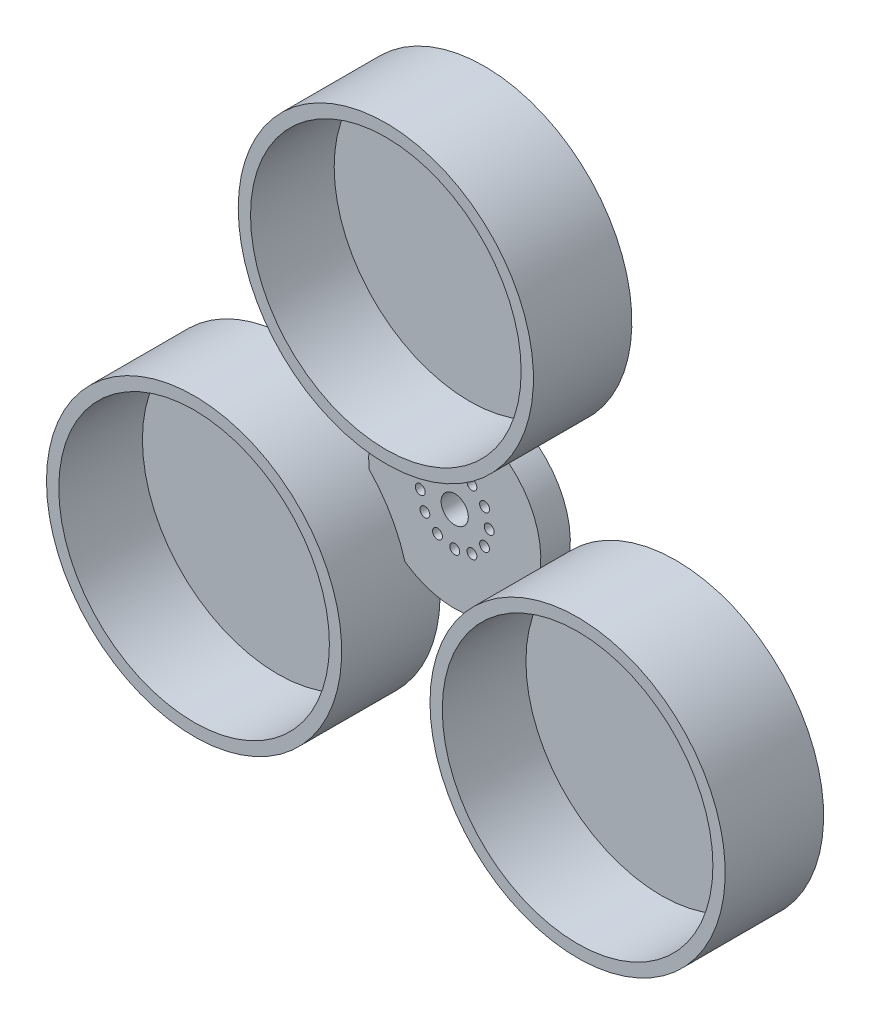
ISO-10303-21;
HEADER;
FILE_DESCRIPTION(('STEP AP214'),'2;1');
FILE_NAME('part.step','',(''),(''),'','','');
FILE_SCHEMA(('AUTOMOTIVE_DESIGN { 1 0 10303 214 1 1 1 1 }'));
ENDSEC;
DATA;
#1=APPLICATION_CONTEXT('core data for automotive mechanical design processes');
#2=APPLICATION_PROTOCOL_DEFINITION('international standard','automotive_design',2000,#1);
#3=PRODUCT_CONTEXT('',#1,'mechanical');
#4=PRODUCT('Part','Part','',(#3));
#5=PRODUCT_RELATED_PRODUCT_CATEGORY('part','',(#4));
#6=PRODUCT_DEFINITION_FORMATION('','',#4);
#7=PRODUCT_DEFINITION_CONTEXT('part definition',#1,'design');
#8=PRODUCT_DEFINITION('design','',#6,#7);
#9=PRODUCT_DEFINITION_SHAPE('','',#8);
#10=(LENGTH_UNIT() NAMED_UNIT(*) SI_UNIT(.MILLI.,.METRE.));
#11=(NAMED_UNIT(*) PLANE_ANGLE_UNIT() SI_UNIT($,.RADIAN.));
#12=(NAMED_UNIT(*) SI_UNIT($,.STERADIAN.) SOLID_ANGLE_UNIT());
#13=UNCERTAINTY_MEASURE_WITH_UNIT(LENGTH_MEASURE(1.E-05),#10,'distance_accuracy_value','');
#14=(GEOMETRIC_REPRESENTATION_CONTEXT(3) GLOBAL_UNCERTAINTY_ASSIGNED_CONTEXT((#13)) GLOBAL_UNIT_ASSIGNED_CONTEXT((#10,
#11,#12)) REPRESENTATION_CONTEXT('',''));
#15=CARTESIAN_POINT('',(0.,0.,0.));
#16=DIRECTION('',(0.,0.,1.));
#17=DIRECTION('',(1.,0.,0.));
#18=AXIS2_PLACEMENT_3D('',#15,#16,#17);
#19=CARTESIAN_POINT('',(0.,0.,6.));
#20=DIRECTION('',(0.,0.,-1.));
#21=DIRECTION('',(-1.,0.,0.));
#22=AXIS2_PLACEMENT_3D('',#19,#20,#21);
#23=CYLINDRICAL_SURFACE('',#22,17.5);
#24=CARTESIAN_POINT('',(0.,0.,0.));
#25=DIRECTION('',(0.,0.,1.));
#26=DIRECTION('',(1.,0.,0.));
#27=AXIS2_PLACEMENT_3D('',#24,#25,#26);
#28=CIRCLE('',#27,17.5);
#29=CARTESIAN_POINT('',(-10.1200985488496,-14.2770306913438,0.));
#30=VERTEX_POINT('',#29);
#31=CARTESIAN_POINT('',(10.1200985488421,-14.2770306913491,0.));
#32=VERTEX_POINT('',#31);
#33=EDGE_CURVE('E52',#30,#32,#28,.T.);
#34=ORIENTED_EDGE('',*,*,#33,.T.);
#35=DIRECTION('',(0.,0.,-1.));
#36=VECTOR('',#35,1.);
#37=CARTESIAN_POINT('',(10.1200985488421,-14.2770306913491,10.));
#38=LINE('',#37,#36);
#39=CARTESIAN_POINT('',(10.1200985488421,-14.2770306913491,6.));
#40=VERTEX_POINT('',#39);
#41=EDGE_CURVE('E11',#32,#40,#38,.F.);
#42=ORIENTED_EDGE('',*,*,#41,.T.);
#43=CARTESIAN_POINT('',(0.,0.,6.));
#44=DIRECTION('',(0.,0.,1.));
#45=DIRECTION('',(1.,0.,0.));
#46=AXIS2_PLACEMENT_3D('',#43,#44,#45);
#47=CIRCLE('',#46,17.5);
#48=CARTESIAN_POINT('',(-10.1200985488496,-14.2770306913438,6.));
#49=VERTEX_POINT('',#48);
#50=EDGE_CURVE('E221',#49,#40,#47,.T.);
#51=ORIENTED_EDGE('',*,*,#50,.F.);
#52=DIRECTION('',(0.,0.,-1.));
#53=VECTOR('',#52,1.);
#54=CARTESIAN_POINT('',(-10.1200985488496,-14.2770306913438,10.));
#55=LINE('',#54,#53);
#56=EDGE_CURVE('E229',#49,#30,#55,.T.);
#57=ORIENTED_EDGE('',*,*,#56,.T.);
#58=EDGE_LOOP('',(#34,#42,#51,#57));
#59=FACE_BOUND('',#58,.T.);
#60=ADVANCED_FACE('F38',(#59),#23,.T.);
#61=CARTESIAN_POINT('',(-7.30422199488881,15.9027777777778,0.));
#62=VERTEX_POINT('',#61);
#63=CARTESIAN_POINT('',(-17.4243205437388,-1.62574708643165,0.));
#64=VERTEX_POINT('',#63);
#65=EDGE_CURVE('E104',#62,#64,#28,.T.);
#66=ORIENTED_EDGE('',*,*,#65,.T.);
#67=DIRECTION('',(0.,0.,-1.));
#68=VECTOR('',#67,1.);
#69=CARTESIAN_POINT('',(-17.4243205437388,-1.62574708643166,10.));
#70=LINE('',#69,#68);
#71=CARTESIAN_POINT('',(-17.4243205437388,-1.62574708643167,6.));
#72=VERTEX_POINT('',#71);
#73=EDGE_CURVE('E108',#64,#72,#70,.F.);
#74=ORIENTED_EDGE('',*,*,#73,.T.);
#75=CARTESIAN_POINT('',(-7.3042219948888,15.9027777777778,6.));
#76=VERTEX_POINT('',#75);
#77=EDGE_CURVE('E218',#76,#72,#47,.T.);
#78=ORIENTED_EDGE('',*,*,#77,.F.);
#79=DIRECTION('',(0.,0.,-1.));
#80=VECTOR('',#79,1.);
#81=CARTESIAN_POINT('',(-7.3042219948888,15.9027777777778,10.));
#82=LINE('',#81,#80);
#83=EDGE_CURVE('E220',#76,#62,#82,.T.);
#84=ORIENTED_EDGE('',*,*,#83,.T.);
#85=EDGE_LOOP('',(#66,#74,#78,#84));
#86=FACE_BOUND('',#85,.T.);
#87=ADVANCED_FACE('F234',(#86),#23,.T.);
#88=CARTESIAN_POINT('',(0.,0.,6.));
#89=DIRECTION('',(0.,0.,-1.));
#90=DIRECTION('',(-1.,0.,0.));
#91=AXIS2_PLACEMENT_3D('',#88,#89,#90);
#92=CYLINDRICAL_SURFACE('',#91,2.75995675837928);
#93=CARTESIAN_POINT('',(0.,0.,6.));
#94=DIRECTION('',(0.,0.,1.));
#95=DIRECTION('',(1.,0.,0.));
#96=AXIS2_PLACEMENT_3D('',#93,#94,#95);
#97=CIRCLE('',#96,2.75995675837928);
#98=CARTESIAN_POINT('',(2.75995675837928,0.,6.));
#99=VERTEX_POINT('',#98);
#100=EDGE_CURVE('E208',#99,#99,#97,.T.);
#101=ORIENTED_EDGE('',*,*,#100,.T.);
#102=EDGE_LOOP('',(#101));
#103=FACE_BOUND('',#102,.T.);
#104=CARTESIAN_POINT('',(0.,0.,2.));
#105=DIRECTION('',(0.,0.,-1.));
#106=DIRECTION('',(-1.,0.,0.));
#107=AXIS2_PLACEMENT_3D('',#104,#105,#106);
#108=CIRCLE('',#107,2.75995675837928);
#109=CARTESIAN_POINT('',(-2.75995675837928,0.,2.));
#110=VERTEX_POINT('',#109);
#111=EDGE_CURVE('E141',#110,#110,#108,.T.);
#112=ORIENTED_EDGE('',*,*,#111,.T.);
#113=EDGE_LOOP('',(#112));
#114=FACE_BOUND('',#113,.T.);
#115=ADVANCED_FACE('F263',(#103,#114),#92,.F.);
#116=CARTESIAN_POINT('',(0.,0.,6.));
#117=DIRECTION('',(0.,0.,1.));
#118=DIRECTION('',(1.,0.,0.));
#119=AXIS2_PLACEMENT_3D('',#116,#117,#118);
#120=PLANE('',#119);
#121=CARTESIAN_POINT('',(38.9711431702969,-22.5000000000017,6.));
#122=DIRECTION('',(0.,0.,1.));
#123=DIRECTION('',(1.,0.,0.));
#124=AXIS2_PLACEMENT_3D('',#121,#122,#123);
#125=CIRCLE('',#124,30.0000000000036);
#126=CARTESIAN_POINT('',(17.4243205437393,-1.62574708642694,6.));
#127=VERTEX_POINT('',#126);
#128=EDGE_CURVE('E60',#127,#40,#125,.T.);
#129=ORIENTED_EDGE('',*,*,#128,.F.);
#130=CARTESIAN_POINT('',(7.3042219948888,15.9027777777778,6.));
#131=VERTEX_POINT('',#130);
#132=EDGE_CURVE('E106',#127,#131,#47,.T.);
#133=ORIENTED_EDGE('',*,*,#132,.T.);
#134=CARTESIAN_POINT('',(0.,45.,6.));
#135=DIRECTION('',(0.,0.,1.));
#136=DIRECTION('',(1.,0.,0.));
#137=AXIS2_PLACEMENT_3D('',#134,#135,#136);
#138=CIRCLE('',#137,30.);
#139=EDGE_CURVE('E133',#76,#131,#138,.T.);
#140=ORIENTED_EDGE('',*,*,#139,.F.);
#141=ORIENTED_EDGE('',*,*,#77,.T.);
#142=CARTESIAN_POINT('',(-38.9711431703026,-22.4999999999983,6.));
#143=DIRECTION('',(0.,0.,1.));
#144=DIRECTION('',(1.,0.,0.));
#145=AXIS2_PLACEMENT_3D('',#142,#143,#144);
#146=CIRCLE('',#145,30.0000000000025);
#147=EDGE_CURVE('E125',#49,#72,#146,.T.);
#148=ORIENTED_EDGE('',*,*,#147,.F.);
#149=ORIENTED_EDGE('',*,*,#50,.T.);
#150=EDGE_LOOP('',(#129,#133,#140,#141,#148,#149));
#151=FACE_BOUND('',#150,.T.);
#152=CARTESIAN_POINT('',(3.50000000000007,6.06217782649103,6.));
#153=DIRECTION('',(0.,0.,1.));
#154=DIRECTION('',(1.,0.,0.));
#155=AXIS2_PLACEMENT_3D('',#152,#153,#154);
#156=CIRCLE('',#155,1.);
#157=CARTESIAN_POINT('',(4.50000000000007,6.06217782649103,6.));
#158=VERTEX_POINT('',#157);
#159=EDGE_CURVE('E151',#158,#158,#156,.T.);
#160=ORIENTED_EDGE('',*,*,#159,.F.);
#161=EDGE_LOOP('',(#160));
#162=FACE_BOUND('',#161,.T.);
#163=CARTESIAN_POINT('',(-3.49999999999994,6.06217782649111,6.));
#164=DIRECTION('',(0.,0.,1.));
#165=DIRECTION('',(1.,0.,0.));
#166=AXIS2_PLACEMENT_3D('',#163,#164,#165);
#167=CIRCLE('',#166,1.);
#168=CARTESIAN_POINT('',(-2.49999999999994,6.06217782649111,6.));
#169=VERTEX_POINT('',#168);
#170=EDGE_CURVE('E163',#169,#169,#167,.T.);
#171=ORIENTED_EDGE('',*,*,#170,.F.);
#172=EDGE_LOOP('',(#171));
#173=FACE_BOUND('',#172,.T.);
#174=CARTESIAN_POINT('',(-7.,0.,6.));
#175=DIRECTION('',(0.,0.,1.));
#176=DIRECTION('',(1.,0.,0.));
#177=AXIS2_PLACEMENT_3D('',#174,#175,#176);
#178=CIRCLE('',#177,1.);
#179=CARTESIAN_POINT('',(-6.,0.,6.));
#180=VERTEX_POINT('',#179);
#181=EDGE_CURVE('E175',#180,#180,#178,.T.);
#182=ORIENTED_EDGE('',*,*,#181,.F.);
#183=EDGE_LOOP('',(#182));
#184=FACE_BOUND('',#183,.T.);
#185=CARTESIAN_POINT('',(-3.50000000000003,-6.06217782649106,6.));
#186=DIRECTION('',(0.,0.,1.));
#187=DIRECTION('',(1.,0.,0.));
#188=AXIS2_PLACEMENT_3D('',#185,#186,#187);
#189=CIRCLE('',#188,1.);
#190=CARTESIAN_POINT('',(-2.50000000000003,-6.06217782649106,6.));
#191=VERTEX_POINT('',#190);
#192=EDGE_CURVE('E187',#191,#191,#189,.T.);
#193=ORIENTED_EDGE('',*,*,#192,.F.);
#194=EDGE_LOOP('',(#193));
#195=FACE_BOUND('',#194,.T.);
#196=CARTESIAN_POINT('',(3.49999999999999,-6.06217782649108,6.));
#197=DIRECTION('',(0.,0.,1.));
#198=DIRECTION('',(1.,0.,0.));
#199=AXIS2_PLACEMENT_3D('',#196,#197,#198);
#200=CIRCLE('',#199,1.);
#201=CARTESIAN_POINT('',(4.49999999999999,-6.06217782649108,6.));
#202=VERTEX_POINT('',#201);
#203=EDGE_CURVE('E199',#202,#202,#200,.T.);
#204=ORIENTED_EDGE('',*,*,#203,.F.);
#205=EDGE_LOOP('',(#204));
#206=FACE_BOUND('',#205,.T.);
#207=ORIENTED_EDGE('',*,*,#100,.F.);
#208=EDGE_LOOP('',(#207));
#209=FACE_BOUND('',#208,.T.);
#210=CARTESIAN_POINT('',(7.,0.,6.));
#211=DIRECTION('',(0.,0.,1.));
#212=DIRECTION('',(1.,0.,0.));
#213=AXIS2_PLACEMENT_3D('',#210,#211,#212);
#214=CIRCLE('',#213,1.);
#215=CARTESIAN_POINT('',(8.,0.,6.));
#216=VERTEX_POINT('',#215);
#217=EDGE_CURVE('E102',#216,#216,#214,.T.);
#218=ORIENTED_EDGE('',*,*,#217,.F.);
#219=EDGE_LOOP('',(#218));
#220=FACE_BOUND('',#219,.T.);
#221=CARTESIAN_POINT('',(6.06217782649107,-3.50000000000001,6.));
#222=DIRECTION('',(0.,0.,1.));
#223=DIRECTION('',(1.,0.,0.));
#224=AXIS2_PLACEMENT_3D('',#221,#222,#223);
#225=CIRCLE('',#224,1.);
#226=CARTESIAN_POINT('',(7.06217782649107,-3.50000000000001,6.));
#227=VERTEX_POINT('',#226);
#228=EDGE_CURVE('E205',#227,#227,#225,.T.);
#229=ORIENTED_EDGE('',*,*,#228,.F.);
#230=EDGE_LOOP('',(#229));
#231=FACE_BOUND('',#230,.T.);
#232=CARTESIAN_POINT('',(0.,-7.,6.));
#233=DIRECTION('',(0.,0.,1.));
#234=DIRECTION('',(1.,0.,0.));
#235=AXIS2_PLACEMENT_3D('',#232,#233,#234);
#236=CIRCLE('',#235,1.);
#237=CARTESIAN_POINT('',(0.999999999999977,-7.,6.));
#238=VERTEX_POINT('',#237);
#239=EDGE_CURVE('E193',#238,#238,#236,.T.);
#240=ORIENTED_EDGE('',*,*,#239,.F.);
#241=EDGE_LOOP('',(#240));
#242=FACE_BOUND('',#241,.T.);
#243=CARTESIAN_POINT('',(-6.06217782649109,-3.49999999999996,6.));
#244=DIRECTION('',(0.,0.,1.));
#245=DIRECTION('',(1.,0.,0.));
#246=AXIS2_PLACEMENT_3D('',#243,#244,#245);
#247=CIRCLE('',#246,1.);
#248=CARTESIAN_POINT('',(-5.06217782649109,-3.49999999999996,6.));
#249=VERTEX_POINT('',#248);
#250=EDGE_CURVE('E181',#249,#249,#247,.T.);
#251=ORIENTED_EDGE('',*,*,#250,.F.);
#252=EDGE_LOOP('',(#251));
#253=FACE_BOUND('',#252,.T.);
#254=CARTESIAN_POINT('',(-6.06217782649104,3.50000000000005,6.));
#255=DIRECTION('',(0.,0.,1.));
#256=DIRECTION('',(1.,0.,0.));
#257=AXIS2_PLACEMENT_3D('',#254,#255,#256);
#258=CIRCLE('',#257,1.);
#259=CARTESIAN_POINT('',(-5.06217782649104,3.50000000000005,6.));
#260=VERTEX_POINT('',#259);
#261=EDGE_CURVE('E169',#260,#260,#258,.T.);
#262=ORIENTED_EDGE('',*,*,#261,.F.);
#263=EDGE_LOOP('',(#262));
#264=FACE_BOUND('',#263,.T.);
#265=CARTESIAN_POINT('',(0.,7.,6.));
#266=DIRECTION('',(0.,0.,1.));
#267=DIRECTION('',(1.,0.,0.));
#268=AXIS2_PLACEMENT_3D('',#265,#266,#267);
#269=CIRCLE('',#268,1.);
#270=CARTESIAN_POINT('',(1.00000000000007,7.,6.));
#271=VERTEX_POINT('',#270);
#272=EDGE_CURVE('E157',#271,#271,#269,.T.);
#273=ORIENTED_EDGE('',*,*,#272,.F.);
#274=EDGE_LOOP('',(#273));
#275=FACE_BOUND('',#274,.T.);
#276=CARTESIAN_POINT('',(6.06217782649112,3.49999999999992,6.));
#277=DIRECTION('',(0.,0.,1.));
#278=DIRECTION('',(1.,0.,0.));
#279=AXIS2_PLACEMENT_3D('',#276,#277,#278);
#280=CIRCLE('',#279,1.);
#281=CARTESIAN_POINT('',(7.06217782649112,3.49999999999992,6.));
#282=VERTEX_POINT('',#281);
#283=EDGE_CURVE('E144',#282,#282,#280,.T.);
#284=ORIENTED_EDGE('',*,*,#283,.F.);
#285=EDGE_LOOP('',(#284));
#286=FACE_BOUND('',#285,.T.);
#287=ADVANCED_FACE('F238',(#151,#162,#173,#184,#195,#206,#209,#220,#231,#242,#253,#264,#275,
#286),#120,.T.);
#288=CARTESIAN_POINT('',(0.,0.,0.));
#289=DIRECTION('',(0.,0.,1.));
#290=DIRECTION('',(1.,0.,0.));
#291=AXIS2_PLACEMENT_3D('',#288,#289,#290);
#292=PLANE('',#291);
#293=CARTESIAN_POINT('',(0.,0.,0.));
#294=DIRECTION('',(0.,0.,-1.));
#295=DIRECTION('',(-1.,0.,0.));
#296=AXIS2_PLACEMENT_3D('',#293,#294,#295);
#297=CIRCLE('',#296,5.);
#298=CARTESIAN_POINT('',(-5.,0.,0.));
#299=VERTEX_POINT('',#298);
#300=EDGE_CURVE('E137',#299,#299,#297,.T.);
#301=ORIENTED_EDGE('',*,*,#300,.F.);
#302=EDGE_LOOP('',(#301));
#303=FACE_BOUND('',#302,.T.);
#304=CARTESIAN_POINT('',(17.4243205437393,-1.62574708642693,0.));
#305=VERTEX_POINT('',#304);
#306=CARTESIAN_POINT('',(7.30422199488881,15.9027777777778,0.));
#307=VERTEX_POINT('',#306);
#308=EDGE_CURVE('E91',#305,#307,#28,.T.);
#309=ORIENTED_EDGE('',*,*,#308,.F.);
#310=CARTESIAN_POINT('',(38.9711431702969,-22.5000000000017,0.));
#311=DIRECTION('',(0.,0.,-1.));
#312=DIRECTION('',(-1.,0.,0.));
#313=AXIS2_PLACEMENT_3D('',#310,#311,#312);
#314=CIRCLE('',#313,30.0000000000036);
#315=EDGE_CURVE('E96',#305,#32,#314,.T.);
#316=ORIENTED_EDGE('',*,*,#315,.T.);
#317=ORIENTED_EDGE('',*,*,#33,.F.);
#318=CARTESIAN_POINT('',(-38.9711431703026,-22.4999999999983,0.));
#319=DIRECTION('',(0.,0.,-1.));
#320=DIRECTION('',(-1.,0.,0.));
#321=AXIS2_PLACEMENT_3D('',#318,#319,#320);
#322=CIRCLE('',#321,30.0000000000025);
#323=EDGE_CURVE('E121',#30,#64,#322,.T.);
#324=ORIENTED_EDGE('',*,*,#323,.T.);
#325=ORIENTED_EDGE('',*,*,#65,.F.);
#326=CARTESIAN_POINT('',(0.,45.,0.));
#327=DIRECTION('',(0.,0.,-1.));
#328=DIRECTION('',(-1.,0.,0.));
#329=AXIS2_PLACEMENT_3D('',#326,#327,#328);
#330=CIRCLE('',#329,30.);
#331=EDGE_CURVE('E98',#62,#307,#330,.T.);
#332=ORIENTED_EDGE('',*,*,#331,.T.);
#333=EDGE_LOOP('',(#309,#316,#317,#324,#325,#332));
#334=FACE_BOUND('',#333,.T.);
#335=CARTESIAN_POINT('',(7.,0.,0.));
#336=DIRECTION('',(0.,0.,1.));
#337=DIRECTION('',(1.,0.,0.));
#338=AXIS2_PLACEMENT_3D('',#335,#336,#337);
#339=CIRCLE('',#338,1.);
#340=CARTESIAN_POINT('',(8.,0.,0.));
#341=VERTEX_POINT('',#340);
#342=EDGE_CURVE('E213',#341,#341,#339,.T.);
#343=ORIENTED_EDGE('',*,*,#342,.T.);
#344=EDGE_LOOP('',(#343));
#345=FACE_BOUND('',#344,.T.);
#346=CARTESIAN_POINT('',(6.06217782649107,-3.50000000000001,0.));
#347=DIRECTION('',(0.,0.,1.));
#348=DIRECTION('',(1.,0.,0.));
#349=AXIS2_PLACEMENT_3D('',#346,#347,#348);
#350=CIRCLE('',#349,1.);
#351=CARTESIAN_POINT('',(7.06217782649107,-3.50000000000001,0.));
#352=VERTEX_POINT('',#351);
#353=EDGE_CURVE('E202',#352,#352,#350,.T.);
#354=ORIENTED_EDGE('',*,*,#353,.T.);
#355=EDGE_LOOP('',(#354));
#356=FACE_BOUND('',#355,.T.);
#357=CARTESIAN_POINT('',(3.49999999999999,-6.06217782649108,0.));
#358=DIRECTION('',(0.,0.,1.));
#359=DIRECTION('',(1.,0.,0.));
#360=AXIS2_PLACEMENT_3D('',#357,#358,#359);
#361=CIRCLE('',#360,1.);
#362=CARTESIAN_POINT('',(4.49999999999999,-6.06217782649108,0.));
#363=VERTEX_POINT('',#362);
#364=EDGE_CURVE('E196',#363,#363,#361,.T.);
#365=ORIENTED_EDGE('',*,*,#364,.T.);
#366=EDGE_LOOP('',(#365));
#367=FACE_BOUND('',#366,.T.);
#368=CARTESIAN_POINT('',(0.,-7.,0.));
#369=DIRECTION('',(0.,0.,1.));
#370=DIRECTION('',(1.,0.,0.));
#371=AXIS2_PLACEMENT_3D('',#368,#369,#370);
#372=CIRCLE('',#371,1.);
#373=CARTESIAN_POINT('',(0.999999999999977,-7.,0.));
#374=VERTEX_POINT('',#373);
#375=EDGE_CURVE('E190',#374,#374,#372,.T.);
#376=ORIENTED_EDGE('',*,*,#375,.T.);
#377=EDGE_LOOP('',(#376));
#378=FACE_BOUND('',#377,.T.);
#379=CARTESIAN_POINT('',(-3.50000000000003,-6.06217782649106,0.));
#380=DIRECTION('',(0.,0.,1.));
#381=DIRECTION('',(1.,0.,0.));
#382=AXIS2_PLACEMENT_3D('',#379,#380,#381);
#383=CIRCLE('',#382,1.);
#384=CARTESIAN_POINT('',(-2.50000000000003,-6.06217782649106,0.));
#385=VERTEX_POINT('',#384);
#386=EDGE_CURVE('E184',#385,#385,#383,.T.);
#387=ORIENTED_EDGE('',*,*,#386,.T.);
#388=EDGE_LOOP('',(#387));
#389=FACE_BOUND('',#388,.T.);
#390=CARTESIAN_POINT('',(-6.06217782649109,-3.49999999999996,0.));
#391=DIRECTION('',(0.,0.,1.));
#392=DIRECTION('',(1.,0.,0.));
#393=AXIS2_PLACEMENT_3D('',#390,#391,#392);
#394=CIRCLE('',#393,1.);
#395=CARTESIAN_POINT('',(-5.06217782649109,-3.49999999999996,0.));
#396=VERTEX_POINT('',#395);
#397=EDGE_CURVE('E178',#396,#396,#394,.T.);
#398=ORIENTED_EDGE('',*,*,#397,.T.);
#399=EDGE_LOOP('',(#398));
#400=FACE_BOUND('',#399,.T.);
#401=CARTESIAN_POINT('',(-7.,0.,0.));
#402=DIRECTION('',(0.,0.,1.));
#403=DIRECTION('',(1.,0.,0.));
#404=AXIS2_PLACEMENT_3D('',#401,#402,#403);
#405=CIRCLE('',#404,1.);
#406=CARTESIAN_POINT('',(-6.,0.,0.));
#407=VERTEX_POINT('',#406);
#408=EDGE_CURVE('E172',#407,#407,#405,.T.);
#409=ORIENTED_EDGE('',*,*,#408,.T.);
#410=EDGE_LOOP('',(#409));
#411=FACE_BOUND('',#410,.T.);
#412=CARTESIAN_POINT('',(-6.06217782649104,3.50000000000005,0.));
#413=DIRECTION('',(0.,0.,1.));
#414=DIRECTION('',(1.,0.,0.));
#415=AXIS2_PLACEMENT_3D('',#412,#413,#414);
#416=CIRCLE('',#415,1.);
#417=CARTESIAN_POINT('',(-5.06217782649104,3.50000000000005,0.));
#418=VERTEX_POINT('',#417);
#419=EDGE_CURVE('E166',#418,#418,#416,.T.);
#420=ORIENTED_EDGE('',*,*,#419,.T.);
#421=EDGE_LOOP('',(#420));
#422=FACE_BOUND('',#421,.T.);
#423=CARTESIAN_POINT('',(-3.49999999999994,6.06217782649111,0.));
#424=DIRECTION('',(0.,0.,1.));
#425=DIRECTION('',(1.,0.,0.));
#426=AXIS2_PLACEMENT_3D('',#423,#424,#425);
#427=CIRCLE('',#426,1.);
#428=CARTESIAN_POINT('',(-2.49999999999994,6.06217782649111,0.));
#429=VERTEX_POINT('',#428);
#430=EDGE_CURVE('E160',#429,#429,#427,.T.);
#431=ORIENTED_EDGE('',*,*,#430,.T.);
#432=EDGE_LOOP('',(#431));
#433=FACE_BOUND('',#432,.T.);
#434=CARTESIAN_POINT('',(0.,7.,0.));
#435=DIRECTION('',(0.,0.,1.));
#436=DIRECTION('',(1.,0.,0.));
#437=AXIS2_PLACEMENT_3D('',#434,#435,#436);
#438=CIRCLE('',#437,1.);
#439=CARTESIAN_POINT('',(1.00000000000007,7.,0.));
#440=VERTEX_POINT('',#439);
#441=EDGE_CURVE('E154',#440,#440,#438,.T.);
#442=ORIENTED_EDGE('',*,*,#441,.T.);
#443=EDGE_LOOP('',(#442));
#444=FACE_BOUND('',#443,.T.);
#445=CARTESIAN_POINT('',(3.50000000000007,6.06217782649103,0.));
#446=DIRECTION('',(0.,0.,1.));
#447=DIRECTION('',(1.,0.,0.));
#448=AXIS2_PLACEMENT_3D('',#445,#446,#447);
#449=CIRCLE('',#448,1.);
#450=CARTESIAN_POINT('',(4.50000000000007,6.06217782649103,0.));
#451=VERTEX_POINT('',#450);
#452=EDGE_CURVE('E147',#451,#451,#449,.T.);
#453=ORIENTED_EDGE('',*,*,#452,.T.);
#454=EDGE_LOOP('',(#453));
#455=FACE_BOUND('',#454,.T.);
#456=CARTESIAN_POINT('',(6.06217782649112,3.49999999999992,0.));
#457=DIRECTION('',(0.,0.,1.));
#458=DIRECTION('',(1.,0.,0.));
#459=AXIS2_PLACEMENT_3D('',#456,#457,#458);
#460=CIRCLE('',#459,1.);
#461=CARTESIAN_POINT('',(7.06217782649112,3.49999999999992,0.));
#462=VERTEX_POINT('',#461);
#463=EDGE_CURVE('E148',#462,#462,#460,.T.);
#464=ORIENTED_EDGE('',*,*,#463,.T.);
#465=EDGE_LOOP('',(#464));
#466=FACE_BOUND('',#465,.T.);
#467=ADVANCED_FACE('F93',(#303,#334,#345,#356,#367,#378,#389,#400,#411,#422,#433,#444,#455,
#466),#292,.F.);
#468=ORIENTED_EDGE('',*,*,#132,.F.);
#469=DIRECTION('',(0.,0.,-1.));
#470=VECTOR('',#469,1.);
#471=CARTESIAN_POINT('',(17.4243205437393,-1.62574708642694,10.));
#472=LINE('',#471,#470);
#473=EDGE_CURVE('E46',#127,#305,#472,.T.);
#474=ORIENTED_EDGE('',*,*,#473,.T.);
#475=ORIENTED_EDGE('',*,*,#308,.T.);
#476=DIRECTION('',(0.,0.,-1.));
#477=VECTOR('',#476,1.);
#478=CARTESIAN_POINT('',(7.3042219948888,15.9027777777778,10.));
#479=LINE('',#478,#477);
#480=EDGE_CURVE('E227',#307,#131,#479,.F.);
#481=ORIENTED_EDGE('',*,*,#480,.T.);
#482=EDGE_LOOP('',(#468,#474,#475,#481));
#483=FACE_BOUND('',#482,.T.);
#484=ADVANCED_FACE('F40',(#483),#23,.T.);
#485=CARTESIAN_POINT('',(7.,0.,6.));
#486=DIRECTION('',(0.,0.,-1.));
#487=DIRECTION('',(-1.,0.,0.));
#488=AXIS2_PLACEMENT_3D('',#485,#486,#487);
#489=CYLINDRICAL_SURFACE('',#488,1.);
#490=ORIENTED_EDGE('',*,*,#217,.T.);
#491=EDGE_LOOP('',(#490));
#492=FACE_BOUND('',#491,.T.);
#493=ORIENTED_EDGE('',*,*,#342,.F.);
#494=EDGE_LOOP('',(#493));
#495=FACE_BOUND('',#494,.T.);
#496=ADVANCED_FACE('F265',(#492,#495),#489,.F.);
#497=CARTESIAN_POINT('',(6.06217782649107,-3.50000000000001,6.));
#498=DIRECTION('',(0.,0.,-1.));
#499=DIRECTION('',(-1.,0.,0.));
#500=AXIS2_PLACEMENT_3D('',#497,#498,#499);
#501=CYLINDRICAL_SURFACE('',#500,1.);
#502=ORIENTED_EDGE('',*,*,#228,.T.);
#503=EDGE_LOOP('',(#502));
#504=FACE_BOUND('',#503,.T.);
#505=ORIENTED_EDGE('',*,*,#353,.F.);
#506=EDGE_LOOP('',(#505));
#507=FACE_BOUND('',#506,.T.);
#508=ADVANCED_FACE('F270',(#504,#507),#501,.F.);
#509=CARTESIAN_POINT('',(3.49999999999999,-6.06217782649108,6.));
#510=DIRECTION('',(0.,0.,-1.));
#511=DIRECTION('',(-1.,0.,0.));
#512=AXIS2_PLACEMENT_3D('',#509,#510,#511);
#513=CYLINDRICAL_SURFACE('',#512,1.);
#514=ORIENTED_EDGE('',*,*,#203,.T.);
#515=EDGE_LOOP('',(#514));
#516=FACE_BOUND('',#515,.T.);
#517=ORIENTED_EDGE('',*,*,#364,.F.);
#518=EDGE_LOOP('',(#517));
#519=FACE_BOUND('',#518,.T.);
#520=ADVANCED_FACE('F285',(#516,#519),#513,.F.);
#521=CARTESIAN_POINT('',(0.,-7.,6.));
#522=DIRECTION('',(0.,0.,-1.));
#523=DIRECTION('',(-1.,0.,0.));
#524=AXIS2_PLACEMENT_3D('',#521,#522,#523);
#525=CYLINDRICAL_SURFACE('',#524,1.);
#526=ORIENTED_EDGE('',*,*,#239,.T.);
#527=EDGE_LOOP('',(#526));
#528=FACE_BOUND('',#527,.T.);
#529=ORIENTED_EDGE('',*,*,#375,.F.);
#530=EDGE_LOOP('',(#529));
#531=FACE_BOUND('',#530,.T.);
#532=ADVANCED_FACE('F289',(#528,#531),#525,.F.);
#533=CARTESIAN_POINT('',(-3.50000000000003,-6.06217782649106,6.));
#534=DIRECTION('',(0.,0.,-1.));
#535=DIRECTION('',(-1.,0.,0.));
#536=AXIS2_PLACEMENT_3D('',#533,#534,#535);
#537=CYLINDRICAL_SURFACE('',#536,1.);
#538=ORIENTED_EDGE('',*,*,#192,.T.);
#539=EDGE_LOOP('',(#538));
#540=FACE_BOUND('',#539,.T.);
#541=ORIENTED_EDGE('',*,*,#386,.F.);
#542=EDGE_LOOP('',(#541));
#543=FACE_BOUND('',#542,.T.);
#544=ADVANCED_FACE('F293',(#540,#543),#537,.F.);
#545=CARTESIAN_POINT('',(-6.06217782649109,-3.49999999999996,6.));
#546=DIRECTION('',(0.,0.,-1.));
#547=DIRECTION('',(-1.,0.,0.));
#548=AXIS2_PLACEMENT_3D('',#545,#546,#547);
#549=CYLINDRICAL_SURFACE('',#548,1.);
#550=ORIENTED_EDGE('',*,*,#250,.T.);
#551=EDGE_LOOP('',(#550));
#552=FACE_BOUND('',#551,.T.);
#553=ORIENTED_EDGE('',*,*,#397,.F.);
#554=EDGE_LOOP('',(#553));
#555=FACE_BOUND('',#554,.T.);
#556=ADVANCED_FACE('F297',(#552,#555),#549,.F.);
#557=CARTESIAN_POINT('',(-7.,0.,6.));
#558=DIRECTION('',(0.,0.,-1.));
#559=DIRECTION('',(-1.,0.,0.));
#560=AXIS2_PLACEMENT_3D('',#557,#558,#559);
#561=CYLINDRICAL_SURFACE('',#560,1.);
#562=ORIENTED_EDGE('',*,*,#181,.T.);
#563=EDGE_LOOP('',(#562));
#564=FACE_BOUND('',#563,.T.);
#565=ORIENTED_EDGE('',*,*,#408,.F.);
#566=EDGE_LOOP('',(#565));
#567=FACE_BOUND('',#566,.T.);
#568=ADVANCED_FACE('F301',(#564,#567),#561,.F.);
#569=CARTESIAN_POINT('',(-6.06217782649104,3.50000000000005,6.));
#570=DIRECTION('',(0.,0.,-1.));
#571=DIRECTION('',(-1.,0.,0.));
#572=AXIS2_PLACEMENT_3D('',#569,#570,#571);
#573=CYLINDRICAL_SURFACE('',#572,1.);
#574=ORIENTED_EDGE('',*,*,#261,.T.);
#575=EDGE_LOOP('',(#574));
#576=FACE_BOUND('',#575,.T.);
#577=ORIENTED_EDGE('',*,*,#419,.F.);
#578=EDGE_LOOP('',(#577));
#579=FACE_BOUND('',#578,.T.);
#580=ADVANCED_FACE('F305',(#576,#579),#573,.F.);
#581=CARTESIAN_POINT('',(-3.49999999999994,6.06217782649111,6.));
#582=DIRECTION('',(0.,0.,-1.));
#583=DIRECTION('',(-1.,0.,0.));
#584=AXIS2_PLACEMENT_3D('',#581,#582,#583);
#585=CYLINDRICAL_SURFACE('',#584,1.);
#586=ORIENTED_EDGE('',*,*,#170,.T.);
#587=EDGE_LOOP('',(#586));
#588=FACE_BOUND('',#587,.T.);
#589=ORIENTED_EDGE('',*,*,#430,.F.);
#590=EDGE_LOOP('',(#589));
#591=FACE_BOUND('',#590,.T.);
#592=ADVANCED_FACE('F309',(#588,#591),#585,.F.);
#593=CARTESIAN_POINT('',(0.,7.,6.));
#594=DIRECTION('',(0.,0.,-1.));
#595=DIRECTION('',(-1.,0.,0.));
#596=AXIS2_PLACEMENT_3D('',#593,#594,#595);
#597=CYLINDRICAL_SURFACE('',#596,1.);
#598=ORIENTED_EDGE('',*,*,#272,.T.);
#599=EDGE_LOOP('',(#598));
#600=FACE_BOUND('',#599,.T.);
#601=ORIENTED_EDGE('',*,*,#441,.F.);
#602=EDGE_LOOP('',(#601));
#603=FACE_BOUND('',#602,.T.);
#604=ADVANCED_FACE('F313',(#600,#603),#597,.F.);
#605=CARTESIAN_POINT('',(3.50000000000007,6.06217782649103,6.));
#606=DIRECTION('',(0.,0.,-1.));
#607=DIRECTION('',(-1.,0.,0.));
#608=AXIS2_PLACEMENT_3D('',#605,#606,#607);
#609=CYLINDRICAL_SURFACE('',#608,1.);
#610=ORIENTED_EDGE('',*,*,#159,.T.);
#611=EDGE_LOOP('',(#610));
#612=FACE_BOUND('',#611,.T.);
#613=ORIENTED_EDGE('',*,*,#452,.F.);
#614=EDGE_LOOP('',(#613));
#615=FACE_BOUND('',#614,.T.);
#616=ADVANCED_FACE('F317',(#612,#615),#609,.F.);
#617=CARTESIAN_POINT('',(6.06217782649112,3.49999999999992,6.));
#618=DIRECTION('',(0.,0.,-1.));
#619=DIRECTION('',(-1.,0.,0.));
#620=AXIS2_PLACEMENT_3D('',#617,#618,#619);
#621=CYLINDRICAL_SURFACE('',#620,1.);
#622=ORIENTED_EDGE('',*,*,#283,.T.);
#623=EDGE_LOOP('',(#622));
#624=FACE_BOUND('',#623,.T.);
#625=ORIENTED_EDGE('',*,*,#463,.F.);
#626=EDGE_LOOP('',(#625));
#627=FACE_BOUND('',#626,.T.);
#628=ADVANCED_FACE('F321',(#624,#627),#621,.F.);
#629=CARTESIAN_POINT('',(0.,0.,2.));
#630=DIRECTION('',(0.,0.,-1.));
#631=DIRECTION('',(-1.,0.,0.));
#632=AXIS2_PLACEMENT_3D('',#629,#630,#631);
#633=CYLINDRICAL_SURFACE('',#632,5.);
#634=CARTESIAN_POINT('',(0.,0.,2.));
#635=DIRECTION('',(0.,0.,-1.));
#636=DIRECTION('',(-1.,0.,0.));
#637=AXIS2_PLACEMENT_3D('',#634,#635,#636);
#638=CIRCLE('',#637,5.);
#639=CARTESIAN_POINT('',(-5.,0.,2.));
#640=VERTEX_POINT('',#639);
#641=EDGE_CURVE('E138',#640,#640,#638,.T.);
#642=ORIENTED_EDGE('',*,*,#641,.F.);
#643=EDGE_LOOP('',(#642));
#644=FACE_BOUND('',#643,.T.);
#645=ORIENTED_EDGE('',*,*,#300,.T.);
#646=EDGE_LOOP('',(#645));
#647=FACE_BOUND('',#646,.T.);
#648=ADVANCED_FACE('F256',(#644,#647),#633,.F.);
#649=CARTESIAN_POINT('',(0.,0.,2.));
#650=DIRECTION('',(0.,0.,-1.));
#651=DIRECTION('',(-1.,0.,0.));
#652=AXIS2_PLACEMENT_3D('',#649,#650,#651);
#653=PLANE('',#652);
#654=ORIENTED_EDGE('',*,*,#111,.F.);
#655=EDGE_LOOP('',(#654));
#656=FACE_BOUND('',#655,.T.);
#657=ORIENTED_EDGE('',*,*,#641,.T.);
#658=EDGE_LOOP('',(#657));
#659=FACE_BOUND('',#658,.T.);
#660=ADVANCED_FACE('F247',(#656,#659),#653,.T.);
#661=CARTESIAN_POINT('',(0.,45.,20.));
#662=DIRECTION('',(0.,0.,-1.));
#663=DIRECTION('',(-1.,0.,0.));
#664=AXIS2_PLACEMENT_3D('',#661,#662,#663);
#665=CYLINDRICAL_SURFACE('',#664,30.);
#666=CARTESIAN_POINT('',(0.,45.,20.));
#667=DIRECTION('',(0.,0.,-1.));
#668=DIRECTION('',(-1.,0.,0.));
#669=AXIS2_PLACEMENT_3D('',#666,#667,#668);
#670=CIRCLE('',#669,30.);
#671=CARTESIAN_POINT('',(-30.,45.,20.));
#672=VERTEX_POINT('',#671);
#673=EDGE_CURVE('E130',#672,#672,#670,.T.);
#674=ORIENTED_EDGE('',*,*,#673,.T.);
#675=EDGE_LOOP('',(#674));
#676=FACE_BOUND('',#675,.T.);
#677=ORIENTED_EDGE('',*,*,#480,.F.);
#678=ORIENTED_EDGE('',*,*,#331,.F.);
#679=ORIENTED_EDGE('',*,*,#83,.F.);
#680=ORIENTED_EDGE('',*,*,#139,.T.);
#681=EDGE_LOOP('',(#677,#678,#679,#680));
#682=FACE_BOUND('',#681,.T.);
#683=ADVANCED_FACE('F244',(#676,#682),#665,.T.);
#684=CARTESIAN_POINT('',(0.,45.,20.));
#685=DIRECTION('',(0.,0.,-1.));
#686=DIRECTION('',(-1.,0.,0.));
#687=AXIS2_PLACEMENT_3D('',#684,#685,#686);
#688=PLANE('',#687);
#689=CARTESIAN_POINT('',(0.,45.,20.));
#690=DIRECTION('',(0.,0.,1.));
#691=DIRECTION('',(1.,0.,0.));
#692=AXIS2_PLACEMENT_3D('',#689,#690,#691);
#693=CIRCLE('',#692,27.5);
#694=CARTESIAN_POINT('',(27.5,45.,20.));
#695=VERTEX_POINT('',#694);
#696=EDGE_CURVE('E116',#695,#695,#693,.T.);
#697=ORIENTED_EDGE('',*,*,#696,.F.);
#698=EDGE_LOOP('',(#697));
#699=FACE_BOUND('',#698,.T.);
#700=ORIENTED_EDGE('',*,*,#673,.F.);
#701=EDGE_LOOP('',(#700));
#702=FACE_BOUND('',#701,.T.);
#703=ADVANCED_FACE('F246',(#699,#702),#688,.F.);
#704=CARTESIAN_POINT('',(-38.9711431703026,-22.4999999999983,20.));
#705=DIRECTION('',(0.,0.,-1.));
#706=DIRECTION('',(-1.,0.,0.));
#707=AXIS2_PLACEMENT_3D('',#704,#705,#706);
#708=CYLINDRICAL_SURFACE('',#707,30.0000000000025);
#709=CARTESIAN_POINT('',(-38.9711431703026,-22.4999999999983,20.));
#710=DIRECTION('',(0.,0.,-1.));
#711=DIRECTION('',(-1.,0.,0.));
#712=AXIS2_PLACEMENT_3D('',#709,#710,#711);
#713=CIRCLE('',#712,30.0000000000025);
#714=CARTESIAN_POINT('',(-68.9711431703051,-22.4999999999983,20.));
#715=VERTEX_POINT('',#714);
#716=EDGE_CURVE('E122',#715,#715,#713,.T.);
#717=ORIENTED_EDGE('',*,*,#716,.T.);
#718=EDGE_LOOP('',(#717));
#719=FACE_BOUND('',#718,.T.);
#720=ORIENTED_EDGE('',*,*,#73,.F.);
#721=ORIENTED_EDGE('',*,*,#323,.F.);
#722=ORIENTED_EDGE('',*,*,#56,.F.);
#723=ORIENTED_EDGE('',*,*,#147,.T.);
#724=EDGE_LOOP('',(#720,#721,#722,#723));
#725=FACE_BOUND('',#724,.T.);
#726=ADVANCED_FACE('F242',(#719,#725),#708,.T.);
#727=CARTESIAN_POINT('',(-38.9711431703026,-22.4999999999983,20.));
#728=DIRECTION('',(0.,0.,-1.));
#729=DIRECTION('',(-1.,0.,0.));
#730=AXIS2_PLACEMENT_3D('',#727,#728,#729);
#731=PLANE('',#730);
#732=CARTESIAN_POINT('',(-38.9711431702969,-22.5000000000017,20.));
#733=DIRECTION('',(0.,0.,1.));
#734=DIRECTION('',(1.,0.,0.));
#735=AXIS2_PLACEMENT_3D('',#732,#733,#734);
#736=CIRCLE('',#735,27.5000000000036);
#737=CARTESIAN_POINT('',(-11.4711431702932,-22.5000000000017,20.));
#738=VERTEX_POINT('',#737);
#739=EDGE_CURVE('E494',#738,#738,#736,.T.);
#740=ORIENTED_EDGE('',*,*,#739,.F.);
#741=EDGE_LOOP('',(#740));
#742=FACE_BOUND('',#741,.T.);
#743=ORIENTED_EDGE('',*,*,#716,.F.);
#744=EDGE_LOOP('',(#743));
#745=FACE_BOUND('',#744,.T.);
#746=ADVANCED_FACE('F382',(#742,#745),#731,.F.);
#747=CARTESIAN_POINT('',(38.9711431702969,-22.5000000000017,20.));
#748=DIRECTION('',(0.,0.,-1.));
#749=DIRECTION('',(-1.,0.,0.));
#750=AXIS2_PLACEMENT_3D('',#747,#748,#749);
#751=CYLINDRICAL_SURFACE('',#750,30.0000000000036);
#752=CARTESIAN_POINT('',(38.9711431702969,-22.5000000000017,20.));
#753=DIRECTION('',(0.,0.,-1.));
#754=DIRECTION('',(-1.,0.,0.));
#755=AXIS2_PLACEMENT_3D('',#752,#753,#754);
#756=CIRCLE('',#755,30.0000000000036);
#757=CARTESIAN_POINT('',(8.97114317029324,-22.5000000000017,20.));
#758=VERTEX_POINT('',#757);
#759=EDGE_CURVE('E110',#758,#758,#756,.T.);
#760=ORIENTED_EDGE('',*,*,#759,.T.);
#761=EDGE_LOOP('',(#760));
#762=FACE_BOUND('',#761,.T.);
#763=ORIENTED_EDGE('',*,*,#41,.F.);
#764=ORIENTED_EDGE('',*,*,#315,.F.);
#765=ORIENTED_EDGE('',*,*,#473,.F.);
#766=ORIENTED_EDGE('',*,*,#128,.T.);
#767=EDGE_LOOP('',(#763,#764,#765,#766));
#768=FACE_BOUND('',#767,.T.);
#769=ADVANCED_FACE('F109',(#762,#768),#751,.T.);
#770=CARTESIAN_POINT('',(38.9711431702969,-22.5000000000017,20.));
#771=DIRECTION('',(0.,0.,-1.));
#772=DIRECTION('',(-1.,0.,0.));
#773=AXIS2_PLACEMENT_3D('',#770,#771,#772);
#774=PLANE('',#773);
#775=CARTESIAN_POINT('',(38.9711431703026,-22.4999999999983,20.));
#776=DIRECTION('',(0.,0.,1.));
#777=DIRECTION('',(1.,0.,0.));
#778=AXIS2_PLACEMENT_3D('',#775,#776,#777);
#779=CIRCLE('',#778,27.5000000000025);
#780=CARTESIAN_POINT('',(66.4711431703051,-22.4999999999983,20.));
#781=VERTEX_POINT('',#780);
#782=EDGE_CURVE('E487',#781,#781,#779,.T.);
#783=ORIENTED_EDGE('',*,*,#782,.F.);
#784=EDGE_LOOP('',(#783));
#785=FACE_BOUND('',#784,.T.);
#786=ORIENTED_EDGE('',*,*,#759,.F.);
#787=EDGE_LOOP('',(#786));
#788=FACE_BOUND('',#787,.T.);
#789=ADVANCED_FACE('F394',(#785,#788),#774,.F.);
#790=CARTESIAN_POINT('',(38.9711431703026,-22.4999999999983,3.));
#791=DIRECTION('',(0.,0.,1.));
#792=DIRECTION('',(1.,0.,0.));
#793=AXIS2_PLACEMENT_3D('',#790,#791,#792);
#794=CYLINDRICAL_SURFACE('',#793,27.5000000000025);
#795=CARTESIAN_POINT('',(38.9711431703026,-22.4999999999983,3.));
#796=DIRECTION('',(0.,0.,1.));
#797=DIRECTION('',(1.,0.,0.));
#798=AXIS2_PLACEMENT_3D('',#795,#796,#797);
#799=CIRCLE('',#798,27.5000000000025);
#800=CARTESIAN_POINT('',(66.4711431703051,-22.4999999999983,3.));
#801=VERTEX_POINT('',#800);
#802=EDGE_CURVE('E484',#801,#801,#799,.T.);
#803=ORIENTED_EDGE('',*,*,#802,.F.);
#804=EDGE_LOOP('',(#803));
#805=FACE_BOUND('',#804,.T.);
#806=ORIENTED_EDGE('',*,*,#782,.T.);
#807=EDGE_LOOP('',(#806));
#808=FACE_BOUND('',#807,.T.);
#809=ADVANCED_FACE('F416',(#805,#808),#794,.F.);
#810=CARTESIAN_POINT('',(38.9711431703026,-22.4999999999983,3.));
#811=DIRECTION('',(0.,0.,1.));
#812=DIRECTION('',(1.,0.,0.));
#813=AXIS2_PLACEMENT_3D('',#810,#811,#812);
#814=PLANE('',#813);
#815=ORIENTED_EDGE('',*,*,#802,.T.);
#816=EDGE_LOOP('',(#815));
#817=FACE_BOUND('',#816,.T.);
#818=ADVANCED_FACE('F426',(#817),#814,.T.);
#819=CARTESIAN_POINT('',(-38.9711431702969,-22.5000000000017,3.));
#820=DIRECTION('',(0.,0.,1.));
#821=DIRECTION('',(1.,0.,0.));
#822=AXIS2_PLACEMENT_3D('',#819,#820,#821);
#823=CYLINDRICAL_SURFACE('',#822,27.5000000000036);
#824=CARTESIAN_POINT('',(-38.9711431702969,-22.5000000000017,3.));
#825=DIRECTION('',(0.,0.,1.));
#826=DIRECTION('',(1.,0.,0.));
#827=AXIS2_PLACEMENT_3D('',#824,#825,#826);
#828=CIRCLE('',#827,27.5000000000036);
#829=CARTESIAN_POINT('',(-11.4711431702932,-22.5000000000017,3.));
#830=VERTEX_POINT('',#829);
#831=EDGE_CURVE('E492',#830,#830,#828,.T.);
#832=ORIENTED_EDGE('',*,*,#831,.F.);
#833=EDGE_LOOP('',(#832));
#834=FACE_BOUND('',#833,.T.);
#835=ORIENTED_EDGE('',*,*,#739,.T.);
#836=EDGE_LOOP('',(#835));
#837=FACE_BOUND('',#836,.T.);
#838=ADVANCED_FACE('F436',(#834,#837),#823,.F.);
#839=CARTESIAN_POINT('',(-38.9711431702969,-22.5000000000017,3.));
#840=DIRECTION('',(0.,0.,1.));
#841=DIRECTION('',(1.,0.,0.));
#842=AXIS2_PLACEMENT_3D('',#839,#840,#841);
#843=PLANE('',#842);
#844=ORIENTED_EDGE('',*,*,#831,.T.);
#845=EDGE_LOOP('',(#844));
#846=FACE_BOUND('',#845,.T.);
#847=ADVANCED_FACE('F446',(#846),#843,.T.);
#848=CARTESIAN_POINT('',(0.,45.,3.));
#849=DIRECTION('',(0.,0.,1.));
#850=DIRECTION('',(1.,0.,0.));
#851=AXIS2_PLACEMENT_3D('',#848,#849,#850);
#852=CYLINDRICAL_SURFACE('',#851,27.5);
#853=CARTESIAN_POINT('',(0.,45.,3.));
#854=DIRECTION('',(0.,0.,1.));
#855=DIRECTION('',(1.,0.,0.));
#856=AXIS2_PLACEMENT_3D('',#853,#854,#855);
#857=CIRCLE('',#856,27.5);
#858=CARTESIAN_POINT('',(27.5,45.,3.));
#859=VERTEX_POINT('',#858);
#860=EDGE_CURVE('E111',#859,#859,#857,.T.);
#861=ORIENTED_EDGE('',*,*,#860,.F.);
#862=EDGE_LOOP('',(#861));
#863=FACE_BOUND('',#862,.T.);
#864=ORIENTED_EDGE('',*,*,#696,.T.);
#865=EDGE_LOOP('',(#864));
#866=FACE_BOUND('',#865,.T.);
#867=ADVANCED_FACE('F456',(#863,#866),#852,.F.);
#868=CARTESIAN_POINT('',(0.,45.,3.));
#869=DIRECTION('',(0.,0.,1.));
#870=DIRECTION('',(1.,0.,0.));
#871=AXIS2_PLACEMENT_3D('',#868,#869,#870);
#872=PLANE('',#871);
#873=ORIENTED_EDGE('',*,*,#860,.T.);
#874=EDGE_LOOP('',(#873));
#875=FACE_BOUND('',#874,.T.);
#876=ADVANCED_FACE('F466',(#875),#872,.T.);
#877=CLOSED_SHELL('',(#60,#87,#115,#287,#467,#484,#496,#508,#520,#532,#544,#556,#568,#580,#592,
#604,#616,#628,#648,#660,#683,#703,#726,#746,#769,#789,#809,#818,#838,#847,#867,#876));
#878=MANIFOLD_SOLID_BREP('B2',#877);
#879=ADVANCED_BREP_SHAPE_REPRESENTATION('',(#18,#878),#14);
#880=SHAPE_DEFINITION_REPRESENTATION(#9,#879);
ENDSEC;
END-ISO-10303-21;
